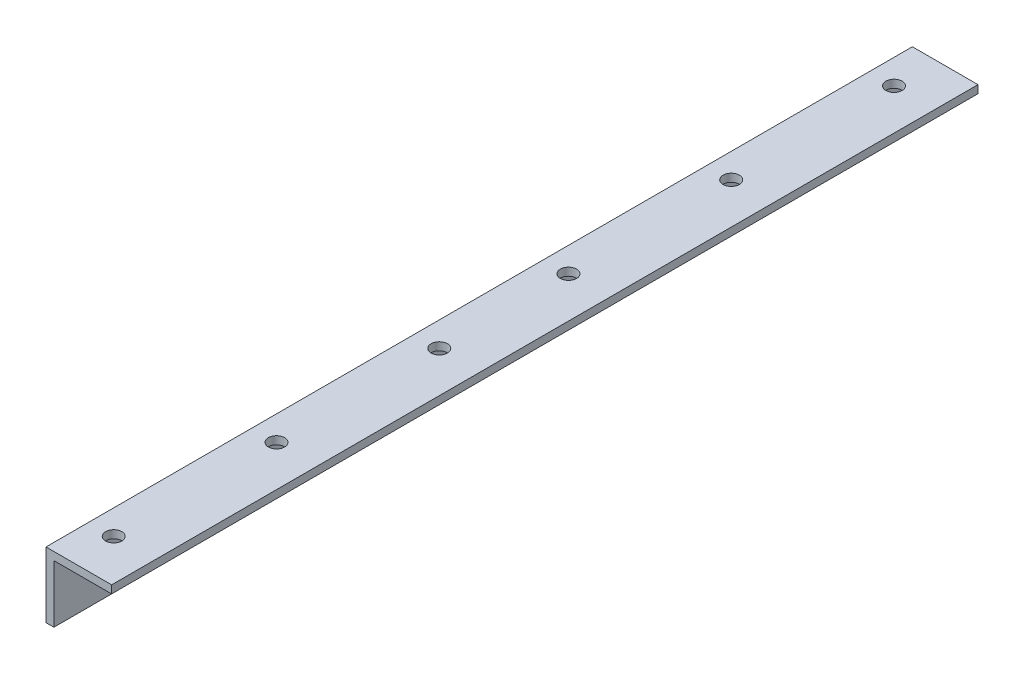
ISO-10303-21;
HEADER;
FILE_DESCRIPTION(('STEP AP214'),'2;1');
FILE_NAME('part.step','',(''),(''),'','','');
FILE_SCHEMA(('AUTOMOTIVE_DESIGN { 1 0 10303 214 1 1 1 1 }'));
ENDSEC;
DATA;
#1=APPLICATION_CONTEXT('core data for automotive mechanical design processes');
#2=APPLICATION_PROTOCOL_DEFINITION('international standard','automotive_design',2000,#1);
#3=PRODUCT_CONTEXT('',#1,'mechanical');
#4=PRODUCT('Part','Part','',(#3));
#5=PRODUCT_RELATED_PRODUCT_CATEGORY('part','',(#4));
#6=PRODUCT_DEFINITION_FORMATION('','',#4);
#7=PRODUCT_DEFINITION_CONTEXT('part definition',#1,'design');
#8=PRODUCT_DEFINITION('design','',#6,#7);
#9=PRODUCT_DEFINITION_SHAPE('','',#8);
#10=(LENGTH_UNIT() NAMED_UNIT(*) SI_UNIT(.MILLI.,.METRE.));
#11=(NAMED_UNIT(*) PLANE_ANGLE_UNIT() SI_UNIT($,.RADIAN.));
#12=(NAMED_UNIT(*) SI_UNIT($,.STERADIAN.) SOLID_ANGLE_UNIT());
#13=UNCERTAINTY_MEASURE_WITH_UNIT(LENGTH_MEASURE(1.E-05),#10,'distance_accuracy_value','');
#14=(GEOMETRIC_REPRESENTATION_CONTEXT(3) GLOBAL_UNCERTAINTY_ASSIGNED_CONTEXT((#13)) GLOBAL_UNIT_ASSIGNED_CONTEXT((#10,
#11,#12)) REPRESENTATION_CONTEXT('',''));
#15=CARTESIAN_POINT('',(0.,0.,0.));
#16=DIRECTION('',(0.,0.,1.));
#17=DIRECTION('',(1.,0.,0.));
#18=AXIS2_PLACEMENT_3D('',#15,#16,#17);
#19=CARTESIAN_POINT('',(-192.,0.,0.));
#20=DIRECTION('',(1.,0.,0.));
#21=DIRECTION('',(0.,0.,-1.));
#22=AXIS2_PLACEMENT_3D('',#19,#20,#21);
#23=PLANE('',#22);
#24=CARTESIAN_POINT('',(-192.,35.6,148.6));
#25=DIRECTION('',(1.,0.,0.));
#26=DIRECTION('',(0.,0.,-1.));
#27=AXIS2_PLACEMENT_3D('',#24,#25,#26);
#28=CIRCLE('',#27,3.175);
#29=CARTESIAN_POINT('',(-192.,35.6,145.425));
#30=VERTEX_POINT('',#29);
#31=EDGE_CURVE('E173',#30,#30,#28,.T.);
#32=ORIENTED_EDGE('',*,*,#31,.F.);
#33=EDGE_LOOP('',(#32));
#34=FACE_BOUND('',#33,.T.);
#35=CARTESIAN_POINT('',(-192.,35.6,24.6000000000001));
#36=DIRECTION('',(1.,0.,0.));
#37=DIRECTION('',(0.,0.,-1.));
#38=AXIS2_PLACEMENT_3D('',#35,#36,#37);
#39=CIRCLE('',#38,3.17499999999997);
#40=CARTESIAN_POINT('',(-192.,35.6,21.4250000000001));
#41=VERTEX_POINT('',#40);
#42=EDGE_CURVE('E157',#41,#41,#39,.T.);
#43=ORIENTED_EDGE('',*,*,#42,.F.);
#44=EDGE_LOOP('',(#43));
#45=FACE_BOUND('',#44,.T.);
#46=CARTESIAN_POINT('',(-192.,35.6,-148.6));
#47=DIRECTION('',(1.,0.,0.));
#48=DIRECTION('',(0.,0.,-1.));
#49=AXIS2_PLACEMENT_3D('',#46,#47,#48);
#50=CIRCLE('',#49,3.175);
#51=CARTESIAN_POINT('',(-192.,35.6,-151.775));
#52=VERTEX_POINT('',#51);
#53=EDGE_CURVE('E139',#52,#52,#50,.T.);
#54=ORIENTED_EDGE('',*,*,#53,.F.);
#55=EDGE_LOOP('',(#54));
#56=FACE_BOUND('',#55,.T.);
#57=CARTESIAN_POINT('',(-192.,35.6,-24.6));
#58=DIRECTION('',(1.,0.,0.));
#59=DIRECTION('',(0.,0.,-1.));
#60=AXIS2_PLACEMENT_3D('',#57,#58,#59);
#61=CIRCLE('',#60,3.17499999999996);
#62=CARTESIAN_POINT('',(-192.,35.6,-27.775));
#63=VERTEX_POINT('',#62);
#64=EDGE_CURVE('E150',#63,#63,#61,.T.);
#65=ORIENTED_EDGE('',*,*,#64,.F.);
#66=EDGE_LOOP('',(#65));
#67=FACE_BOUND('',#66,.T.);
#68=CARTESIAN_POINT('',(-192.,35.6,86.6000000000001));
#69=DIRECTION('',(1.,0.,0.));
#70=DIRECTION('',(0.,0.,-1.));
#71=AXIS2_PLACEMENT_3D('',#68,#69,#70);
#72=CIRCLE('',#71,3.17499999999997);
#73=CARTESIAN_POINT('',(-192.,35.6,83.4250000000001));
#74=VERTEX_POINT('',#73);
#75=EDGE_CURVE('E165',#74,#74,#72,.T.);
#76=ORIENTED_EDGE('',*,*,#75,.F.);
#77=EDGE_LOOP('',(#76));
#78=FACE_BOUND('',#77,.T.);
#79=CARTESIAN_POINT('',(-192.,35.6,-86.6));
#80=DIRECTION('',(1.,0.,0.));
#81=DIRECTION('',(0.,0.,-1.));
#82=AXIS2_PLACEMENT_3D('',#79,#80,#81);
#83=CIRCLE('',#82,3.17499999999997);
#84=CARTESIAN_POINT('',(-192.,35.6,-89.775));
#85=VERTEX_POINT('',#84);
#86=EDGE_CURVE('E181',#85,#85,#83,.T.);
#87=ORIENTED_EDGE('',*,*,#86,.F.);
#88=EDGE_LOOP('',(#87));
#89=FACE_BOUND('',#88,.T.);
#90=DIRECTION('',(0.,1.,0.));
#91=VECTOR('',#90,1.);
#92=CARTESIAN_POINT('',(-192.,50.,-165.));
#93=LINE('',#92,#91);
#94=CARTESIAN_POINT('',(-192.,20.,-165.));
#95=VERTEX_POINT('',#94);
#96=CARTESIAN_POINT('',(-192.,42.,-165.));
#97=VERTEX_POINT('',#96);
#98=EDGE_CURVE('E66',#95,#97,#93,.T.);
#99=ORIENTED_EDGE('',*,*,#98,.T.);
#100=DIRECTION('',(0.,0.,1.));
#101=VECTOR('',#100,1.);
#102=CARTESIAN_POINT('',(-192.,42.,0.));
#103=LINE('',#102,#101);
#104=CARTESIAN_POINT('',(-192.,42.,165.));
#105=VERTEX_POINT('',#104);
#106=EDGE_CURVE('E61',#97,#105,#103,.T.);
#107=ORIENTED_EDGE('',*,*,#106,.T.);
#108=DIRECTION('',(0.,-1.,0.));
#109=VECTOR('',#108,1.);
#110=CARTESIAN_POINT('',(-192.,50.,165.));
#111=LINE('',#110,#109);
#112=CARTESIAN_POINT('',(-192.,20.,165.));
#113=VERTEX_POINT('',#112);
#114=EDGE_CURVE('E124',#105,#113,#111,.T.);
#115=ORIENTED_EDGE('',*,*,#114,.T.);
#116=DIRECTION('',(0.,0.,-1.));
#117=VECTOR('',#116,1.);
#118=CARTESIAN_POINT('',(-192.,20.,165.));
#119=LINE('',#118,#117);
#120=EDGE_CURVE('E129',#113,#95,#119,.T.);
#121=ORIENTED_EDGE('',*,*,#120,.T.);
#122=EDGE_LOOP('',(#99,#107,#115,#121));
#123=FACE_BOUND('',#122,.T.);
#124=ADVANCED_FACE('F45',(#34,#45,#56,#67,#78,#89,#123),#23,.T.);
#125=CARTESIAN_POINT('',(-195.,0.,0.));
#126=DIRECTION('',(1.,0.,0.));
#127=DIRECTION('',(0.,0.,-1.));
#128=AXIS2_PLACEMENT_3D('',#125,#126,#127);
#129=PLANE('',#128);
#130=DIRECTION('',(0.,-1.,0.));
#131=VECTOR('',#130,1.);
#132=CARTESIAN_POINT('',(-195.,50.,165.));
#133=LINE('',#132,#131);
#134=CARTESIAN_POINT('',(-195.,44.9999999999994,165.));
#135=VERTEX_POINT('',#134);
#136=CARTESIAN_POINT('',(-195.,20.,165.));
#137=VERTEX_POINT('',#136);
#138=EDGE_CURVE('E116',#135,#137,#133,.T.);
#139=ORIENTED_EDGE('',*,*,#138,.F.);
#140=DIRECTION('',(0.,0.,-1.));
#141=VECTOR('',#140,1.);
#142=CARTESIAN_POINT('',(-195.,44.9999999999994,188.));
#143=LINE('',#142,#141);
#144=CARTESIAN_POINT('',(-195.,45.,-165.));
#145=VERTEX_POINT('',#144);
#146=EDGE_CURVE('E101',#135,#145,#143,.T.);
#147=ORIENTED_EDGE('',*,*,#146,.T.);
#148=DIRECTION('',(0.,1.,0.));
#149=VECTOR('',#148,1.);
#150=CARTESIAN_POINT('',(-195.,50.,-165.));
#151=LINE('',#150,#149);
#152=CARTESIAN_POINT('',(-195.,20.,-165.));
#153=VERTEX_POINT('',#152);
#154=EDGE_CURVE('E115',#153,#145,#151,.T.);
#155=ORIENTED_EDGE('',*,*,#154,.F.);
#156=DIRECTION('',(0.,0.,-1.));
#157=VECTOR('',#156,1.);
#158=CARTESIAN_POINT('',(-195.,20.,165.));
#159=LINE('',#158,#157);
#160=EDGE_CURVE('E125',#137,#153,#159,.T.);
#161=ORIENTED_EDGE('',*,*,#160,.F.);
#162=EDGE_LOOP('',(#139,#147,#155,#161));
#163=FACE_BOUND('',#162,.T.);
#164=CARTESIAN_POINT('',(-195.,35.6,-148.6));
#165=DIRECTION('',(1.,0.,0.));
#166=DIRECTION('',(0.,0.,-1.));
#167=AXIS2_PLACEMENT_3D('',#164,#165,#166);
#168=CIRCLE('',#167,3.175);
#169=CARTESIAN_POINT('',(-195.,35.6,-151.775));
#170=VERTEX_POINT('',#169);
#171=EDGE_CURVE('E144',#170,#170,#168,.T.);
#172=ORIENTED_EDGE('',*,*,#171,.T.);
#173=EDGE_LOOP('',(#172));
#174=FACE_BOUND('',#173,.T.);
#175=CARTESIAN_POINT('',(-195.,35.6,-24.6));
#176=DIRECTION('',(1.,0.,0.));
#177=DIRECTION('',(0.,0.,-1.));
#178=AXIS2_PLACEMENT_3D('',#175,#176,#177);
#179=CIRCLE('',#178,3.17499999999996);
#180=CARTESIAN_POINT('',(-195.,35.6,-27.775));
#181=VERTEX_POINT('',#180);
#182=EDGE_CURVE('E153',#181,#181,#179,.T.);
#183=ORIENTED_EDGE('',*,*,#182,.T.);
#184=EDGE_LOOP('',(#183));
#185=FACE_BOUND('',#184,.T.);
#186=CARTESIAN_POINT('',(-195.,35.6,24.6000000000001));
#187=DIRECTION('',(1.,0.,0.));
#188=DIRECTION('',(0.,0.,-1.));
#189=AXIS2_PLACEMENT_3D('',#186,#187,#188);
#190=CIRCLE('',#189,3.17499999999997);
#191=CARTESIAN_POINT('',(-195.,35.6,21.4250000000001));
#192=VERTEX_POINT('',#191);
#193=EDGE_CURVE('E161',#192,#192,#190,.T.);
#194=ORIENTED_EDGE('',*,*,#193,.T.);
#195=EDGE_LOOP('',(#194));
#196=FACE_BOUND('',#195,.T.);
#197=CARTESIAN_POINT('',(-195.,35.6,86.6000000000001));
#198=DIRECTION('',(1.,0.,0.));
#199=DIRECTION('',(0.,0.,-1.));
#200=AXIS2_PLACEMENT_3D('',#197,#198,#199);
#201=CIRCLE('',#200,3.17499999999997);
#202=CARTESIAN_POINT('',(-195.,35.6,83.4250000000001));
#203=VERTEX_POINT('',#202);
#204=EDGE_CURVE('E169',#203,#203,#201,.T.);
#205=ORIENTED_EDGE('',*,*,#204,.T.);
#206=EDGE_LOOP('',(#205));
#207=FACE_BOUND('',#206,.T.);
#208=CARTESIAN_POINT('',(-195.,35.6,148.6));
#209=DIRECTION('',(1.,0.,0.));
#210=DIRECTION('',(0.,0.,-1.));
#211=AXIS2_PLACEMENT_3D('',#208,#209,#210);
#212=CIRCLE('',#211,3.175);
#213=CARTESIAN_POINT('',(-195.,35.6,145.425));
#214=VERTEX_POINT('',#213);
#215=EDGE_CURVE('E177',#214,#214,#212,.T.);
#216=ORIENTED_EDGE('',*,*,#215,.T.);
#217=EDGE_LOOP('',(#216));
#218=FACE_BOUND('',#217,.T.);
#219=CARTESIAN_POINT('',(-195.,35.6,-86.6));
#220=DIRECTION('',(1.,0.,0.));
#221=DIRECTION('',(0.,0.,-1.));
#222=AXIS2_PLACEMENT_3D('',#219,#220,#221);
#223=CIRCLE('',#222,3.17499999999997);
#224=CARTESIAN_POINT('',(-195.,35.6,-89.775));
#225=VERTEX_POINT('',#224);
#226=EDGE_CURVE('E185',#225,#225,#223,.T.);
#227=ORIENTED_EDGE('',*,*,#226,.T.);
#228=EDGE_LOOP('',(#227));
#229=FACE_BOUND('',#228,.T.);
#230=ADVANCED_FACE('F112',(#163,#174,#185,#196,#207,#218,#229),#129,.F.);
#231=CARTESIAN_POINT('',(-192.,50.,165.));
#232=DIRECTION('',(0.,0.,-1.));
#233=DIRECTION('',(-1.,0.,0.));
#234=AXIS2_PLACEMENT_3D('',#231,#232,#233);
#235=PLANE('',#234);
#236=DIRECTION('',(1.,0.,0.));
#237=VECTOR('',#236,1.);
#238=CARTESIAN_POINT('',(-200.,45.,165.));
#239=LINE('',#238,#237);
#240=CARTESIAN_POINT('',(-170.,45.,165.));
#241=VERTEX_POINT('',#240);
#242=EDGE_CURVE('E204',#135,#241,#239,.T.);
#243=ORIENTED_EDGE('',*,*,#242,.F.);
#244=ORIENTED_EDGE('',*,*,#138,.T.);
#245=DIRECTION('',(-1.,0.,0.));
#246=VECTOR('',#245,1.);
#247=CARTESIAN_POINT('',(-192.,20.,165.));
#248=LINE('',#247,#246);
#249=EDGE_CURVE('E11',#113,#137,#248,.T.);
#250=ORIENTED_EDGE('',*,*,#249,.F.);
#251=ORIENTED_EDGE('',*,*,#114,.F.);
#252=DIRECTION('',(1.,0.,0.));
#253=VECTOR('',#252,1.);
#254=CARTESIAN_POINT('',(-200.,42.,165.));
#255=LINE('',#254,#253);
#256=CARTESIAN_POINT('',(-170.,42.,165.));
#257=VERTEX_POINT('',#256);
#258=EDGE_CURVE('E108',#105,#257,#255,.T.);
#259=ORIENTED_EDGE('',*,*,#258,.T.);
#260=DIRECTION('',(0.,1.,0.));
#261=VECTOR('',#260,1.);
#262=CARTESIAN_POINT('',(-170.,42.,165.));
#263=LINE('',#262,#261);
#264=EDGE_CURVE('E195',#257,#241,#263,.T.);
#265=ORIENTED_EDGE('',*,*,#264,.T.);
#266=EDGE_LOOP('',(#243,#244,#250,#251,#259,#265));
#267=FACE_BOUND('',#266,.T.);
#268=ADVANCED_FACE('F47',(#267),#235,.F.);
#269=CARTESIAN_POINT('',(-192.,20.,165.));
#270=DIRECTION('',(0.,1.,0.));
#271=DIRECTION('',(0.,0.,1.));
#272=AXIS2_PLACEMENT_3D('',#269,#270,#271);
#273=PLANE('',#272);
#274=ORIENTED_EDGE('',*,*,#160,.T.);
#275=DIRECTION('',(-1.,0.,0.));
#276=VECTOR('',#275,1.);
#277=CARTESIAN_POINT('',(-192.,20.,-165.));
#278=LINE('',#277,#276);
#279=EDGE_CURVE('E54',#95,#153,#278,.T.);
#280=ORIENTED_EDGE('',*,*,#279,.F.);
#281=ORIENTED_EDGE('',*,*,#120,.F.);
#282=ORIENTED_EDGE('',*,*,#249,.T.);
#283=EDGE_LOOP('',(#274,#280,#281,#282));
#284=FACE_BOUND('',#283,.T.);
#285=ADVANCED_FACE('F317',(#284),#273,.F.);
#286=CARTESIAN_POINT('',(-192.,50.,-165.));
#287=DIRECTION('',(0.,0.,1.));
#288=DIRECTION('',(0.,-1.,0.));
#289=AXIS2_PLACEMENT_3D('',#286,#287,#288);
#290=PLANE('',#289);
#291=ORIENTED_EDGE('',*,*,#154,.T.);
#292=DIRECTION('',(-1.,0.,0.));
#293=VECTOR('',#292,1.);
#294=CARTESIAN_POINT('',(-200.,45.,-165.));
#295=LINE('',#294,#293);
#296=CARTESIAN_POINT('',(-170.,45.,-165.));
#297=VERTEX_POINT('',#296);
#298=EDGE_CURVE('E98',#297,#145,#295,.T.);
#299=ORIENTED_EDGE('',*,*,#298,.F.);
#300=DIRECTION('',(0.,1.,0.));
#301=VECTOR('',#300,1.);
#302=CARTESIAN_POINT('',(-170.,42.,-165.));
#303=LINE('',#302,#301);
#304=CARTESIAN_POINT('',(-170.,42.,-165.));
#305=VERTEX_POINT('',#304);
#306=EDGE_CURVE('E194',#305,#297,#303,.T.);
#307=ORIENTED_EDGE('',*,*,#306,.F.);
#308=DIRECTION('',(-1.,0.,0.));
#309=VECTOR('',#308,1.);
#310=CARTESIAN_POINT('',(-200.,42.,-165.));
#311=LINE('',#310,#309);
#312=EDGE_CURVE('E199',#305,#97,#311,.T.);
#313=ORIENTED_EDGE('',*,*,#312,.T.);
#314=ORIENTED_EDGE('',*,*,#98,.F.);
#315=ORIENTED_EDGE('',*,*,#279,.T.);
#316=EDGE_LOOP('',(#291,#299,#307,#313,#314,#315));
#317=FACE_BOUND('',#316,.T.);
#318=ADVANCED_FACE('F121',(#317),#290,.F.);
#319=CARTESIAN_POINT('',(-192.,35.6,-148.6));
#320=DIRECTION('',(-1.,0.,0.));
#321=DIRECTION('',(0.,0.,1.));
#322=AXIS2_PLACEMENT_3D('',#319,#320,#321);
#323=CYLINDRICAL_SURFACE('',#322,3.175);
#324=ORIENTED_EDGE('',*,*,#53,.T.);
#325=EDGE_LOOP('',(#324));
#326=FACE_BOUND('',#325,.T.);
#327=ORIENTED_EDGE('',*,*,#171,.F.);
#328=EDGE_LOOP('',(#327));
#329=FACE_BOUND('',#328,.T.);
#330=ADVANCED_FACE('F313',(#326,#329),#323,.F.);
#331=CARTESIAN_POINT('',(-192.,35.6,-24.6));
#332=DIRECTION('',(-1.,0.,0.));
#333=DIRECTION('',(0.,0.,1.));
#334=AXIS2_PLACEMENT_3D('',#331,#332,#333);
#335=CYLINDRICAL_SURFACE('',#334,3.17499999999996);
#336=ORIENTED_EDGE('',*,*,#64,.T.);
#337=EDGE_LOOP('',(#336));
#338=FACE_BOUND('',#337,.T.);
#339=ORIENTED_EDGE('',*,*,#182,.F.);
#340=EDGE_LOOP('',(#339));
#341=FACE_BOUND('',#340,.T.);
#342=ADVANCED_FACE('F349',(#338,#341),#335,.F.);
#343=CARTESIAN_POINT('',(-192.,35.6,24.6000000000001));
#344=DIRECTION('',(-1.,0.,0.));
#345=DIRECTION('',(0.,0.,1.));
#346=AXIS2_PLACEMENT_3D('',#343,#344,#345);
#347=CYLINDRICAL_SURFACE('',#346,3.17499999999997);
#348=ORIENTED_EDGE('',*,*,#42,.T.);
#349=EDGE_LOOP('',(#348));
#350=FACE_BOUND('',#349,.T.);
#351=ORIENTED_EDGE('',*,*,#193,.F.);
#352=EDGE_LOOP('',(#351));
#353=FACE_BOUND('',#352,.T.);
#354=ADVANCED_FACE('F346',(#350,#353),#347,.F.);
#355=CARTESIAN_POINT('',(-192.,35.6,86.6000000000001));
#356=DIRECTION('',(-1.,0.,0.));
#357=DIRECTION('',(0.,0.,1.));
#358=AXIS2_PLACEMENT_3D('',#355,#356,#357);
#359=CYLINDRICAL_SURFACE('',#358,3.17499999999997);
#360=ORIENTED_EDGE('',*,*,#75,.T.);
#361=EDGE_LOOP('',(#360));
#362=FACE_BOUND('',#361,.T.);
#363=ORIENTED_EDGE('',*,*,#204,.F.);
#364=EDGE_LOOP('',(#363));
#365=FACE_BOUND('',#364,.T.);
#366=ADVANCED_FACE('F342',(#362,#365),#359,.F.);
#367=CARTESIAN_POINT('',(-192.,35.6,148.6));
#368=DIRECTION('',(-1.,0.,0.));
#369=DIRECTION('',(0.,0.,1.));
#370=AXIS2_PLACEMENT_3D('',#367,#368,#369);
#371=CYLINDRICAL_SURFACE('',#370,3.175);
#372=ORIENTED_EDGE('',*,*,#31,.T.);
#373=EDGE_LOOP('',(#372));
#374=FACE_BOUND('',#373,.T.);
#375=ORIENTED_EDGE('',*,*,#215,.F.);
#376=EDGE_LOOP('',(#375));
#377=FACE_BOUND('',#376,.T.);
#378=ADVANCED_FACE('F336',(#374,#377),#371,.F.);
#379=CARTESIAN_POINT('',(-192.,35.6,-86.6));
#380=DIRECTION('',(-1.,0.,0.));
#381=DIRECTION('',(0.,0.,1.));
#382=AXIS2_PLACEMENT_3D('',#379,#380,#381);
#383=CYLINDRICAL_SURFACE('',#382,3.17499999999997);
#384=ORIENTED_EDGE('',*,*,#86,.T.);
#385=EDGE_LOOP('',(#384));
#386=FACE_BOUND('',#385,.T.);
#387=ORIENTED_EDGE('',*,*,#226,.F.);
#388=EDGE_LOOP('',(#387));
#389=FACE_BOUND('',#388,.T.);
#390=ADVANCED_FACE('F332',(#386,#389),#383,.F.);
#391=CARTESIAN_POINT('',(-170.,42.,-165.));
#392=DIRECTION('',(1.,0.,0.));
#393=DIRECTION('',(0.,0.,-1.));
#394=AXIS2_PLACEMENT_3D('',#391,#392,#393);
#395=PLANE('',#394);
#396=DIRECTION('',(0.,0.,-1.));
#397=VECTOR('',#396,1.);
#398=CARTESIAN_POINT('',(-170.,45.,-165.));
#399=LINE('',#398,#397);
#400=EDGE_CURVE('E104',#241,#297,#399,.T.);
#401=ORIENTED_EDGE('',*,*,#400,.F.);
#402=ORIENTED_EDGE('',*,*,#264,.F.);
#403=DIRECTION('',(0.,0.,-1.));
#404=VECTOR('',#403,1.);
#405=CARTESIAN_POINT('',(-170.,42.,-165.));
#406=LINE('',#405,#404);
#407=EDGE_CURVE('E211',#257,#305,#406,.T.);
#408=ORIENTED_EDGE('',*,*,#407,.T.);
#409=ORIENTED_EDGE('',*,*,#306,.T.);
#410=EDGE_LOOP('',(#401,#402,#408,#409));
#411=FACE_BOUND('',#410,.T.);
#412=ADVANCED_FACE('F331',(#411),#395,.T.);
#413=CARTESIAN_POINT('',(0.,42.,0.));
#414=DIRECTION('',(0.,1.,0.));
#415=DIRECTION('',(0.,0.,1.));
#416=AXIS2_PLACEMENT_3D('',#413,#414,#415);
#417=PLANE('',#416);
#418=ORIENTED_EDGE('',*,*,#106,.F.);
#419=ORIENTED_EDGE('',*,*,#312,.F.);
#420=ORIENTED_EDGE('',*,*,#407,.F.);
#421=ORIENTED_EDGE('',*,*,#258,.F.);
#422=EDGE_LOOP('',(#418,#419,#420,#421));
#423=FACE_BOUND('',#422,.T.);
#424=CARTESIAN_POINT('',(-185.599999999998,42.,24.5999999999999));
#425=DIRECTION('',(0.,1.,0.));
#426=DIRECTION('',(0.,0.,1.));
#427=AXIS2_PLACEMENT_3D('',#424,#425,#426);
#428=CIRCLE('',#427,3.09999999999999);
#429=CARTESIAN_POINT('',(-185.599999999998,42.,27.6999999999999));
#430=VERTEX_POINT('',#429);
#431=EDGE_CURVE('E253',#430,#430,#428,.T.);
#432=ORIENTED_EDGE('',*,*,#431,.T.);
#433=EDGE_LOOP('',(#432));
#434=FACE_BOUND('',#433,.T.);
#435=CARTESIAN_POINT('',(-185.599999999999,42.,86.5999999999999));
#436=DIRECTION('',(0.,1.,0.));
#437=DIRECTION('',(0.,0.,1.));
#438=AXIS2_PLACEMENT_3D('',#435,#436,#437);
#439=CIRCLE('',#438,3.09999999999999);
#440=CARTESIAN_POINT('',(-185.599999999999,42.,89.6999999999999));
#441=VERTEX_POINT('',#440);
#442=EDGE_CURVE('E245',#441,#441,#439,.T.);
#443=ORIENTED_EDGE('',*,*,#442,.T.);
#444=EDGE_LOOP('',(#443));
#445=FACE_BOUND('',#444,.T.);
#446=CARTESIAN_POINT('',(-185.599999999999,42.,148.6));
#447=DIRECTION('',(0.,1.,0.));
#448=DIRECTION('',(0.,0.,1.));
#449=AXIS2_PLACEMENT_3D('',#446,#447,#448);
#450=CIRCLE('',#449,3.09999999999999);
#451=CARTESIAN_POINT('',(-185.599999999999,42.,151.7));
#452=VERTEX_POINT('',#451);
#453=EDGE_CURVE('E237',#452,#452,#450,.T.);
#454=ORIENTED_EDGE('',*,*,#453,.T.);
#455=EDGE_LOOP('',(#454));
#456=FACE_BOUND('',#455,.T.);
#457=CARTESIAN_POINT('',(-185.599999999998,42.,-24.5999999999999));
#458=DIRECTION('',(0.,1.,0.));
#459=DIRECTION('',(0.,0.,1.));
#460=AXIS2_PLACEMENT_3D('',#457,#458,#459);
#461=CIRCLE('',#460,3.09999999999999);
#462=CARTESIAN_POINT('',(-185.599999999998,42.,-21.4999999999999));
#463=VERTEX_POINT('',#462);
#464=EDGE_CURVE('E229',#463,#463,#461,.T.);
#465=ORIENTED_EDGE('',*,*,#464,.T.);
#466=EDGE_LOOP('',(#465));
#467=FACE_BOUND('',#466,.T.);
#468=CARTESIAN_POINT('',(-185.599999999999,42.,-86.5999999999999));
#469=DIRECTION('',(0.,1.,0.));
#470=DIRECTION('',(0.,0.,1.));
#471=AXIS2_PLACEMENT_3D('',#468,#469,#470);
#472=CIRCLE('',#471,3.09999999999999);
#473=CARTESIAN_POINT('',(-185.599999999999,42.,-83.4999999999999));
#474=VERTEX_POINT('',#473);
#475=EDGE_CURVE('E221',#474,#474,#472,.T.);
#476=ORIENTED_EDGE('',*,*,#475,.T.);
#477=EDGE_LOOP('',(#476));
#478=FACE_BOUND('',#477,.T.);
#479=CARTESIAN_POINT('',(-185.599999999999,42.,-148.6));
#480=DIRECTION('',(0.,1.,0.));
#481=DIRECTION('',(0.,0.,1.));
#482=AXIS2_PLACEMENT_3D('',#479,#480,#481);
#483=CIRCLE('',#482,3.09999999999999);
#484=CARTESIAN_POINT('',(-185.599999999999,42.,-145.5));
#485=VERTEX_POINT('',#484);
#486=EDGE_CURVE('E207',#485,#485,#483,.T.);
#487=ORIENTED_EDGE('',*,*,#486,.T.);
#488=EDGE_LOOP('',(#487));
#489=FACE_BOUND('',#488,.T.);
#490=ADVANCED_FACE('F264',(#423,#434,#445,#456,#467,#478,#489),#417,.F.);
#491=CARTESIAN_POINT('',(0.,45.,0.));
#492=DIRECTION('',(0.,1.,0.));
#493=DIRECTION('',(0.,0.,1.));
#494=AXIS2_PLACEMENT_3D('',#491,#492,#493);
#495=PLANE('',#494);
#496=CARTESIAN_POINT('',(-185.599999999998,45.,24.5999999999999));
#497=DIRECTION('',(0.,1.,0.));
#498=DIRECTION('',(0.,0.,1.));
#499=AXIS2_PLACEMENT_3D('',#496,#497,#498);
#500=CIRCLE('',#499,3.09999999999999);
#501=CARTESIAN_POINT('',(-185.599999999998,45.,27.6999999999999));
#502=VERTEX_POINT('',#501);
#503=EDGE_CURVE('E118',#502,#502,#500,.T.);
#504=ORIENTED_EDGE('',*,*,#503,.F.);
#505=EDGE_LOOP('',(#504));
#506=FACE_BOUND('',#505,.T.);
#507=CARTESIAN_POINT('',(-185.599999999999,45.,86.5999999999999));
#508=DIRECTION('',(0.,1.,0.));
#509=DIRECTION('',(0.,0.,1.));
#510=AXIS2_PLACEMENT_3D('',#507,#508,#509);
#511=CIRCLE('',#510,3.09999999999999);
#512=CARTESIAN_POINT('',(-185.599999999999,45.,89.6999999999999));
#513=VERTEX_POINT('',#512);
#514=EDGE_CURVE('E249',#513,#513,#511,.T.);
#515=ORIENTED_EDGE('',*,*,#514,.F.);
#516=EDGE_LOOP('',(#515));
#517=FACE_BOUND('',#516,.T.);
#518=CARTESIAN_POINT('',(-185.599999999999,45.,148.6));
#519=DIRECTION('',(0.,1.,0.));
#520=DIRECTION('',(0.,0.,1.));
#521=AXIS2_PLACEMENT_3D('',#518,#519,#520);
#522=CIRCLE('',#521,3.09999999999999);
#523=CARTESIAN_POINT('',(-185.599999999999,45.,151.7));
#524=VERTEX_POINT('',#523);
#525=EDGE_CURVE('E241',#524,#524,#522,.T.);
#526=ORIENTED_EDGE('',*,*,#525,.F.);
#527=EDGE_LOOP('',(#526));
#528=FACE_BOUND('',#527,.T.);
#529=CARTESIAN_POINT('',(-185.599999999998,45.,-24.5999999999999));
#530=DIRECTION('',(0.,1.,0.));
#531=DIRECTION('',(0.,0.,1.));
#532=AXIS2_PLACEMENT_3D('',#529,#530,#531);
#533=CIRCLE('',#532,3.09999999999999);
#534=CARTESIAN_POINT('',(-185.599999999998,45.,-21.4999999999999));
#535=VERTEX_POINT('',#534);
#536=EDGE_CURVE('E233',#535,#535,#533,.T.);
#537=ORIENTED_EDGE('',*,*,#536,.F.);
#538=EDGE_LOOP('',(#537));
#539=FACE_BOUND('',#538,.T.);
#540=CARTESIAN_POINT('',(-185.599999999999,45.,-86.5999999999999));
#541=DIRECTION('',(0.,1.,0.));
#542=DIRECTION('',(0.,0.,1.));
#543=AXIS2_PLACEMENT_3D('',#540,#541,#542);
#544=CIRCLE('',#543,3.09999999999999);
#545=CARTESIAN_POINT('',(-185.599999999999,45.,-83.4999999999999));
#546=VERTEX_POINT('',#545);
#547=EDGE_CURVE('E225',#546,#546,#544,.T.);
#548=ORIENTED_EDGE('',*,*,#547,.F.);
#549=EDGE_LOOP('',(#548));
#550=FACE_BOUND('',#549,.T.);
#551=CARTESIAN_POINT('',(-185.599999999999,45.,-148.6));
#552=DIRECTION('',(0.,1.,0.));
#553=DIRECTION('',(0.,0.,1.));
#554=AXIS2_PLACEMENT_3D('',#551,#552,#553);
#555=CIRCLE('',#554,3.09999999999999);
#556=CARTESIAN_POINT('',(-185.599999999999,45.,-145.5));
#557=VERTEX_POINT('',#556);
#558=EDGE_CURVE('E217',#557,#557,#555,.T.);
#559=ORIENTED_EDGE('',*,*,#558,.F.);
#560=EDGE_LOOP('',(#559));
#561=FACE_BOUND('',#560,.T.);
#562=ORIENTED_EDGE('',*,*,#298,.T.);
#563=ORIENTED_EDGE('',*,*,#146,.F.);
#564=ORIENTED_EDGE('',*,*,#242,.T.);
#565=ORIENTED_EDGE('',*,*,#400,.T.);
#566=EDGE_LOOP('',(#562,#563,#564,#565));
#567=FACE_BOUND('',#566,.T.);
#568=ADVANCED_FACE('F100',(#506,#517,#528,#539,#550,#561,#567),#495,.T.);
#569=CARTESIAN_POINT('',(-185.599999999999,42.,-148.6));
#570=DIRECTION('',(0.,1.,0.));
#571=DIRECTION('',(0.,0.,1.));
#572=AXIS2_PLACEMENT_3D('',#569,#570,#571);
#573=CYLINDRICAL_SURFACE('',#572,3.09999999999999);
#574=ORIENTED_EDGE('',*,*,#486,.F.);
#575=EDGE_LOOP('',(#574));
#576=FACE_BOUND('',#575,.T.);
#577=ORIENTED_EDGE('',*,*,#558,.T.);
#578=EDGE_LOOP('',(#577));
#579=FACE_BOUND('',#578,.T.);
#580=ADVANCED_FACE('F276',(#576,#579),#573,.F.);
#581=CARTESIAN_POINT('',(-185.599999999999,42.,-86.5999999999999));
#582=DIRECTION('',(0.,1.,0.));
#583=DIRECTION('',(0.,0.,1.));
#584=AXIS2_PLACEMENT_3D('',#581,#582,#583);
#585=CYLINDRICAL_SURFACE('',#584,3.09999999999999);
#586=ORIENTED_EDGE('',*,*,#475,.F.);
#587=EDGE_LOOP('',(#586));
#588=FACE_BOUND('',#587,.T.);
#589=ORIENTED_EDGE('',*,*,#547,.T.);
#590=EDGE_LOOP('',(#589));
#591=FACE_BOUND('',#590,.T.);
#592=ADVANCED_FACE('F289',(#588,#591),#585,.F.);
#593=CARTESIAN_POINT('',(-185.599999999998,42.,-24.5999999999999));
#594=DIRECTION('',(0.,1.,0.));
#595=DIRECTION('',(0.,0.,1.));
#596=AXIS2_PLACEMENT_3D('',#593,#594,#595);
#597=CYLINDRICAL_SURFACE('',#596,3.09999999999999);
#598=ORIENTED_EDGE('',*,*,#464,.F.);
#599=EDGE_LOOP('',(#598));
#600=FACE_BOUND('',#599,.T.);
#601=ORIENTED_EDGE('',*,*,#536,.T.);
#602=EDGE_LOOP('',(#601));
#603=FACE_BOUND('',#602,.T.);
#604=ADVANCED_FACE('F296',(#600,#603),#597,.F.);
#605=CARTESIAN_POINT('',(-185.599999999999,42.,148.6));
#606=DIRECTION('',(0.,1.,0.));
#607=DIRECTION('',(0.,0.,1.));
#608=AXIS2_PLACEMENT_3D('',#605,#606,#607);
#609=CYLINDRICAL_SURFACE('',#608,3.09999999999999);
#610=ORIENTED_EDGE('',*,*,#453,.F.);
#611=EDGE_LOOP('',(#610));
#612=FACE_BOUND('',#611,.T.);
#613=ORIENTED_EDGE('',*,*,#525,.T.);
#614=EDGE_LOOP('',(#613));
#615=FACE_BOUND('',#614,.T.);
#616=ADVANCED_FACE('F468',(#612,#615),#609,.F.);
#617=CARTESIAN_POINT('',(-185.599999999999,42.,86.5999999999999));
#618=DIRECTION('',(0.,1.,0.));
#619=DIRECTION('',(0.,0.,1.));
#620=AXIS2_PLACEMENT_3D('',#617,#618,#619);
#621=CYLINDRICAL_SURFACE('',#620,3.09999999999999);
#622=ORIENTED_EDGE('',*,*,#442,.F.);
#623=EDGE_LOOP('',(#622));
#624=FACE_BOUND('',#623,.T.);
#625=ORIENTED_EDGE('',*,*,#514,.T.);
#626=EDGE_LOOP('',(#625));
#627=FACE_BOUND('',#626,.T.);
#628=ADVANCED_FACE('F270',(#624,#627),#621,.F.);
#629=CARTESIAN_POINT('',(-185.599999999998,42.,24.5999999999999));
#630=DIRECTION('',(0.,1.,0.));
#631=DIRECTION('',(0.,0.,1.));
#632=AXIS2_PLACEMENT_3D('',#629,#630,#631);
#633=CYLINDRICAL_SURFACE('',#632,3.09999999999999);
#634=ORIENTED_EDGE('',*,*,#431,.F.);
#635=EDGE_LOOP('',(#634));
#636=FACE_BOUND('',#635,.T.);
#637=ORIENTED_EDGE('',*,*,#503,.T.);
#638=EDGE_LOOP('',(#637));
#639=FACE_BOUND('',#638,.T.);
#640=ADVANCED_FACE('F267',(#636,#639),#633,.F.);
#641=CLOSED_SHELL('',(#124,#230,#268,#285,#318,#330,#342,#354,#366,#378,#390,#412,#490,#568,
#580,#592,#604,#616,#628,#640));
#642=MANIFOLD_SOLID_BREP('B2',#641);
#643=ADVANCED_BREP_SHAPE_REPRESENTATION('',(#18,#642),#14);
#644=SHAPE_DEFINITION_REPRESENTATION(#9,#643);
ENDSEC;
END-ISO-10303-21;
